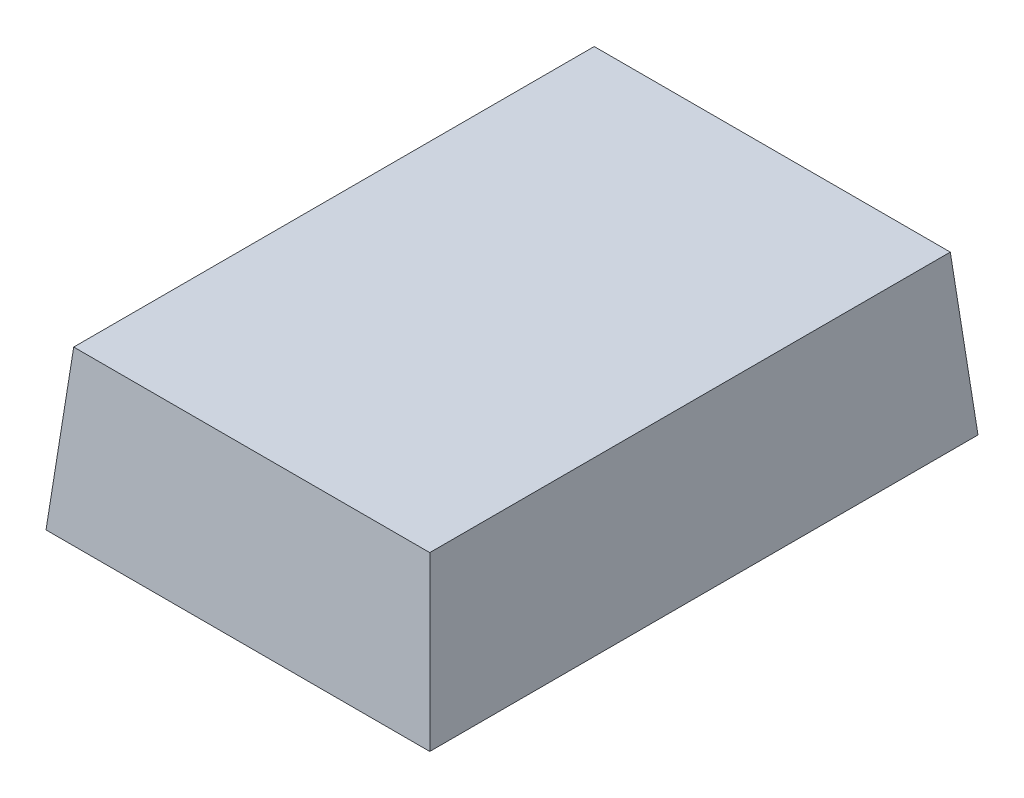
ISO-10303-21;
HEADER;
FILE_DESCRIPTION(('STEP AP214'),'2;1');
FILE_NAME('part.step','',(''),(''),'','','');
FILE_SCHEMA(('AUTOMOTIVE_DESIGN { 1 0 10303 214 1 1 1 1 }'));
ENDSEC;
DATA;
#1=APPLICATION_CONTEXT('core data for automotive mechanical design processes');
#2=APPLICATION_PROTOCOL_DEFINITION('international standard','automotive_design',2000,#1);
#3=PRODUCT_CONTEXT('',#1,'mechanical');
#4=PRODUCT('Part','Part','',(#3));
#5=PRODUCT_RELATED_PRODUCT_CATEGORY('part','',(#4));
#6=PRODUCT_DEFINITION_FORMATION('','',#4);
#7=PRODUCT_DEFINITION_CONTEXT('part definition',#1,'design');
#8=PRODUCT_DEFINITION('design','',#6,#7);
#9=PRODUCT_DEFINITION_SHAPE('','',#8);
#10=(LENGTH_UNIT() NAMED_UNIT(*) SI_UNIT(.MILLI.,.METRE.));
#11=(NAMED_UNIT(*) PLANE_ANGLE_UNIT() SI_UNIT($,.RADIAN.));
#12=(NAMED_UNIT(*) SI_UNIT($,.STERADIAN.) SOLID_ANGLE_UNIT());
#13=UNCERTAINTY_MEASURE_WITH_UNIT(LENGTH_MEASURE(1.E-05),#10,'distance_accuracy_value','');
#14=(GEOMETRIC_REPRESENTATION_CONTEXT(3) GLOBAL_UNCERTAINTY_ASSIGNED_CONTEXT((#13)) GLOBAL_UNIT_ASSIGNED_CONTEXT((#10,
#11,#12)) REPRESENTATION_CONTEXT('',''));
#15=CARTESIAN_POINT('',(0.,0.,0.));
#16=DIRECTION('',(0.,0.,1.));
#17=DIRECTION('',(1.,0.,0.));
#18=AXIS2_PLACEMENT_3D('',#15,#16,#17);
#19=CARTESIAN_POINT('',(0.,0.28,0.));
#20=DIRECTION('',(0.,1.,0.));
#21=DIRECTION('',(1.,0.,0.));
#22=AXIS2_PLACEMENT_3D('',#19,#20,#21);
#23=PLANE('',#22);
#24=DIRECTION('',(0.,0.,-1.));
#25=VECTOR('',#24,1.);
#26=CARTESIAN_POINT('',(0.63,0.28,-0.9));
#27=LINE('',#26,#25);
#28=CARTESIAN_POINT('',(0.63,0.28,0.9));
#29=VERTEX_POINT('',#28);
#30=CARTESIAN_POINT('',(0.63,0.28,-0.9));
#31=VERTEX_POINT('',#30);
#32=EDGE_CURVE('E88',#29,#31,#27,.T.);
#33=ORIENTED_EDGE('',*,*,#32,.F.);
#34=DIRECTION('',(1.,0.,0.));
#35=VECTOR('',#34,1.);
#36=CARTESIAN_POINT('',(-0.63,0.28,0.9));
#37=LINE('',#36,#35);
#38=CARTESIAN_POINT('',(-0.63,0.28,0.9));
#39=VERTEX_POINT('',#38);
#40=EDGE_CURVE('E21',#39,#29,#37,.T.);
#41=ORIENTED_EDGE('',*,*,#40,.F.);
#42=DIRECTION('',(0.,0.,1.));
#43=VECTOR('',#42,1.);
#44=CARTESIAN_POINT('',(-0.63,0.28,-0.9));
#45=LINE('',#44,#43);
#46=CARTESIAN_POINT('',(-0.63,0.28,-0.9));
#47=VERTEX_POINT('',#46);
#48=EDGE_CURVE('E64',#47,#39,#45,.T.);
#49=ORIENTED_EDGE('',*,*,#48,.F.);
#50=DIRECTION('',(-1.,0.,0.));
#51=VECTOR('',#50,1.);
#52=CARTESIAN_POINT('',(-0.63,0.28,-0.9));
#53=LINE('',#52,#51);
#54=EDGE_CURVE('E74',#31,#47,#53,.T.);
#55=ORIENTED_EDGE('',*,*,#54,.F.);
#56=EDGE_LOOP('',(#33,#41,#49,#55));
#57=FACE_BOUND('',#56,.T.);
#58=ADVANCED_FACE('F17',(#57),#23,.F.);
#59=CARTESIAN_POINT('',(0.,0.8,0.));
#60=DIRECTION('',(0.,1.,0.));
#61=DIRECTION('',(1.,0.,0.));
#62=AXIS2_PLACEMENT_3D('',#59,#60,#61);
#63=PLANE('',#62);
#64=DIRECTION('',(0.,0.,-1.));
#65=VECTOR('',#64,1.);
#66=CARTESIAN_POINT('',(0.584505894967,0.8,-0.9));
#67=LINE('',#66,#65);
#68=CARTESIAN_POINT('',(0.584505894967,0.8,0.854505894967));
#69=VERTEX_POINT('',#68);
#70=CARTESIAN_POINT('',(0.584505894967,0.8,-0.854505894967));
#71=VERTEX_POINT('',#70);
#72=EDGE_CURVE('E90',#69,#71,#67,.T.);
#73=ORIENTED_EDGE('',*,*,#72,.T.);
#74=DIRECTION('',(-1.,0.,0.));
#75=VECTOR('',#74,1.);
#76=CARTESIAN_POINT('',(-0.63,0.8,-0.854505894967));
#77=LINE('',#76,#75);
#78=CARTESIAN_POINT('',(-0.584505894967,0.8,-0.854505894967));
#79=VERTEX_POINT('',#78);
#80=EDGE_CURVE('E105',#71,#79,#77,.T.);
#81=ORIENTED_EDGE('',*,*,#80,.T.);
#82=DIRECTION('',(0.,0.,1.));
#83=VECTOR('',#82,1.);
#84=CARTESIAN_POINT('',(-0.584505894967,0.8,-0.9));
#85=LINE('',#84,#83);
#86=CARTESIAN_POINT('',(-0.584505894967,0.8,0.854505894967));
#87=VERTEX_POINT('',#86);
#88=EDGE_CURVE('E55',#79,#87,#85,.T.);
#89=ORIENTED_EDGE('',*,*,#88,.T.);
#90=DIRECTION('',(1.,0.,0.));
#91=VECTOR('',#90,1.);
#92=CARTESIAN_POINT('',(-0.63,0.8,0.854505894967));
#93=LINE('',#92,#91);
#94=EDGE_CURVE('E11',#87,#69,#93,.T.);
#95=ORIENTED_EDGE('',*,*,#94,.T.);
#96=EDGE_LOOP('',(#73,#81,#89,#95));
#97=FACE_BOUND('',#96,.T.);
#98=ADVANCED_FACE('F120',(#97),#63,.T.);
#99=CARTESIAN_POINT('',(-0.63,0.28,0.9));
#100=DIRECTION('',(0.,0.0871557427476379,0.996194698091747));
#101=DIRECTION('',(1.,0.,0.));
#102=AXIS2_PLACEMENT_3D('',#99,#100,#101);
#103=PLANE('',#102);
#104=ORIENTED_EDGE('',*,*,#40,.T.);
#105=DIRECTION('',(0.0868265938642471,-0.992432509138967,0.0868265938642471));
#106=VECTOR('',#105,1.);
#107=CARTESIAN_POINT('',(0.616430056676,0.435105161936,0.886430056676));
#108=LINE('',#107,#106);
#109=EDGE_CURVE('E80',#69,#29,#108,.T.);
#110=ORIENTED_EDGE('',*,*,#109,.F.);
#111=ORIENTED_EDGE('',*,*,#94,.F.);
#112=DIRECTION('',(-0.0868265938642471,-0.992432509138967,0.0868265938642471));
#113=VECTOR('',#112,1.);
#114=CARTESIAN_POINT('',(-0.63,0.28,0.9));
#115=LINE('',#114,#113);
#116=EDGE_CURVE('E82',#87,#39,#115,.T.);
#117=ORIENTED_EDGE('',*,*,#116,.T.);
#118=EDGE_LOOP('',(#104,#110,#111,#117));
#119=FACE_BOUND('',#118,.T.);
#120=ADVANCED_FACE('F19',(#119),#103,.T.);
#121=CARTESIAN_POINT('',(-0.63,0.28,-0.9));
#122=DIRECTION('',(-0.996194698091747,0.0871557427476379,0.));
#123=DIRECTION('',(0.,0.,1.));
#124=AXIS2_PLACEMENT_3D('',#121,#122,#123);
#125=PLANE('',#124);
#126=ORIENTED_EDGE('',*,*,#48,.T.);
#127=ORIENTED_EDGE('',*,*,#116,.F.);
#128=ORIENTED_EDGE('',*,*,#88,.F.);
#129=DIRECTION('',(-0.0868265938642471,-0.992432509138967,-0.0868265938642471));
#130=VECTOR('',#129,1.);
#131=CARTESIAN_POINT('',(-0.63,0.28,-0.9));
#132=LINE('',#131,#130);
#133=EDGE_CURVE('E108',#79,#47,#132,.T.);
#134=ORIENTED_EDGE('',*,*,#133,.T.);
#135=EDGE_LOOP('',(#126,#127,#128,#134));
#136=FACE_BOUND('',#135,.T.);
#137=ADVANCED_FACE('F121',(#136),#125,.T.);
#138=CARTESIAN_POINT('',(-0.63,0.28,-0.9));
#139=DIRECTION('',(0.,0.0871557427476379,-0.996194698091747));
#140=DIRECTION('',(-1.,0.,0.));
#141=AXIS2_PLACEMENT_3D('',#138,#139,#140);
#142=PLANE('',#141);
#143=ORIENTED_EDGE('',*,*,#54,.T.);
#144=ORIENTED_EDGE('',*,*,#133,.F.);
#145=ORIENTED_EDGE('',*,*,#80,.F.);
#146=DIRECTION('',(0.0868265938642471,-0.992432509138967,-0.0868265938642471));
#147=VECTOR('',#146,1.);
#148=CARTESIAN_POINT('',(0.620501039673,0.388573613355,-0.890501039673));
#149=LINE('',#148,#147);
#150=EDGE_CURVE('E93',#71,#31,#149,.T.);
#151=ORIENTED_EDGE('',*,*,#150,.T.);
#152=EDGE_LOOP('',(#143,#144,#145,#151));
#153=FACE_BOUND('',#152,.T.);
#154=ADVANCED_FACE('F118',(#153),#142,.T.);
#155=CARTESIAN_POINT('',(0.63,0.28,-0.9));
#156=DIRECTION('',(0.996194698091747,0.0871557427476379,0.));
#157=DIRECTION('',(0.,0.,-1.));
#158=AXIS2_PLACEMENT_3D('',#155,#156,#157);
#159=PLANE('',#158);
#160=ORIENTED_EDGE('',*,*,#32,.T.);
#161=ORIENTED_EDGE('',*,*,#150,.F.);
#162=ORIENTED_EDGE('',*,*,#72,.F.);
#163=ORIENTED_EDGE('',*,*,#109,.T.);
#164=EDGE_LOOP('',(#160,#161,#162,#163));
#165=FACE_BOUND('',#164,.T.);
#166=ADVANCED_FACE('F86',(#165),#159,.T.);
#167=CLOSED_SHELL('',(#58,#98,#120,#137,#154,#166));
#168=MANIFOLD_SOLID_BREP('B1',#167);
#169=ADVANCED_BREP_SHAPE_REPRESENTATION('',(#18,#168),#14);
#170=SHAPE_DEFINITION_REPRESENTATION(#9,#169);
ENDSEC;
END-ISO-10303-21;
